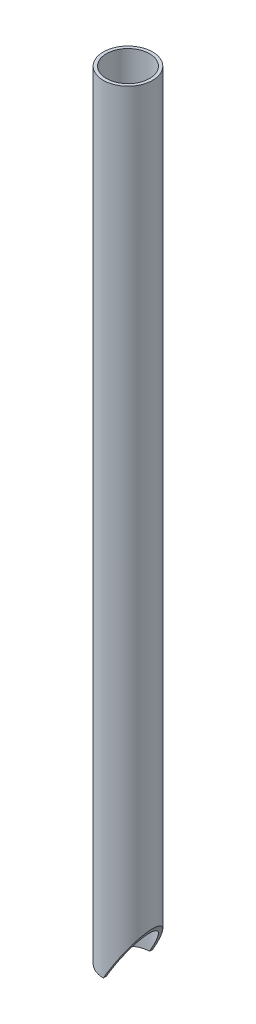
ISO-10303-21;
HEADER;
FILE_DESCRIPTION(('STEP AP214'),'2;1');
FILE_NAME('part.step','',(''),(''),'','','');
FILE_SCHEMA(('AUTOMOTIVE_DESIGN { 1 0 10303 214 1 1 1 1 }'));
ENDSEC;
DATA;
#1=APPLICATION_CONTEXT('core data for automotive mechanical design processes');
#2=APPLICATION_PROTOCOL_DEFINITION('international standard','automotive_design',2000,#1);
#3=PRODUCT_CONTEXT('',#1,'mechanical');
#4=PRODUCT('Part','Part','',(#3));
#5=PRODUCT_RELATED_PRODUCT_CATEGORY('part','',(#4));
#6=PRODUCT_DEFINITION_FORMATION('','',#4);
#7=PRODUCT_DEFINITION_CONTEXT('part definition',#1,'design');
#8=PRODUCT_DEFINITION('design','',#6,#7);
#9=PRODUCT_DEFINITION_SHAPE('','',#8);
#10=(LENGTH_UNIT() NAMED_UNIT(*) SI_UNIT(.MILLI.,.METRE.));
#11=(NAMED_UNIT(*) PLANE_ANGLE_UNIT() SI_UNIT($,.RADIAN.));
#12=(NAMED_UNIT(*) SI_UNIT($,.STERADIAN.) SOLID_ANGLE_UNIT());
#13=UNCERTAINTY_MEASURE_WITH_UNIT(LENGTH_MEASURE(1.E-05),#10,'distance_accuracy_value','');
#14=(GEOMETRIC_REPRESENTATION_CONTEXT(3) GLOBAL_UNCERTAINTY_ASSIGNED_CONTEXT((#13)) GLOBAL_UNIT_ASSIGNED_CONTEXT((#10,
#11,#12)) REPRESENTATION_CONTEXT('',''));
#15=CARTESIAN_POINT('',(0.,0.,0.));
#16=DIRECTION('',(0.,0.,1.));
#17=DIRECTION('',(1.,0.,0.));
#18=AXIS2_PLACEMENT_3D('',#15,#16,#17);
#19=CARTESIAN_POINT('',(0.,0.,0.));
#20=DIRECTION('',(0.,1.,0.));
#21=DIRECTION('',(0.,0.,1.));
#22=AXIS2_PLACEMENT_3D('',#19,#20,#21);
#23=PLANE('',#22);
#24=DIRECTION('',(0.,0.,-1.));
#25=VECTOR('',#24,1.);
#26=CARTESIAN_POINT('',(0.,0.,272.58));
#27=LINE('',#26,#25);
#28=CARTESIAN_POINT('',(0.,0.,8.00000000000006));
#29=VERTEX_POINT('',#28);
#30=CARTESIAN_POINT('',(0.,0.,7.));
#31=VERTEX_POINT('',#30);
#32=EDGE_CURVE('E57',#29,#31,#27,.T.);
#33=ORIENTED_EDGE('',*,*,#32,.F.);
#34=CARTESIAN_POINT('',(0.,0.,0.));
#35=DIRECTION('',(0.,1.,0.));
#36=DIRECTION('',(0.,0.,1.));
#37=AXIS2_PLACEMENT_3D('',#34,#35,#36);
#38=CIRCLE('',#37,8.);
#39=CARTESIAN_POINT('',(0.,0.,-7.99999999999995));
#40=VERTEX_POINT('',#39);
#41=EDGE_CURVE('E76',#40,#29,#38,.T.);
#42=ORIENTED_EDGE('',*,*,#41,.F.);
#43=CARTESIAN_POINT('',(0.,0.,-6.99999999999995));
#44=VERTEX_POINT('',#43);
#45=EDGE_CURVE('E61',#44,#40,#27,.T.);
#46=ORIENTED_EDGE('',*,*,#45,.F.);
#47=CARTESIAN_POINT('',(0.,0.,0.));
#48=DIRECTION('',(0.,1.,0.));
#49=DIRECTION('',(0.,0.,1.));
#50=AXIS2_PLACEMENT_3D('',#47,#48,#49);
#51=CIRCLE('',#50,7.);
#52=EDGE_CURVE('E72',#44,#31,#51,.T.);
#53=ORIENTED_EDGE('',*,*,#52,.T.);
#54=EDGE_LOOP('',(#33,#42,#46,#53));
#55=FACE_BOUND('',#54,.T.);
#56=ADVANCED_FACE('F41',(#55),#23,.F.);
#57=CARTESIAN_POINT('',(0.,252.432034355964,0.));
#58=DIRECTION('',(0.,-1.,0.));
#59=DIRECTION('',(0.,0.,-1.));
#60=AXIS2_PLACEMENT_3D('',#57,#58,#59);
#61=CYLINDRICAL_SURFACE('',#60,8.);
#62=CARTESIAN_POINT('',(0.,252.432034355964,0.));
#63=DIRECTION('',(0.,1.,0.));
#64=DIRECTION('',(0.,0.,1.));
#65=AXIS2_PLACEMENT_3D('',#62,#63,#64);
#66=CIRCLE('',#65,8.);
#67=CARTESIAN_POINT('',(0.,252.432034355964,8.));
#68=VERTEX_POINT('',#67);
#69=EDGE_CURVE('E50',#68,#68,#66,.T.);
#70=ORIENTED_EDGE('',*,*,#69,.F.);
#71=EDGE_LOOP('',(#70));
#72=FACE_BOUND('',#71,.T.);
#73=CARTESIAN_POINT('',(0.,0.,0.));
#74=DIRECTION('',(0.86602540378444,-0.499999999999998,0.));
#75=DIRECTION('',(-0.499999999999998,-0.86602540378444,0.));
#76=AXIS2_PLACEMENT_3D('',#73,#74,#75);
#77=ELLIPSE('',#76,16.0000000000001,8.);
#78=EDGE_CURVE('E66',#40,#29,#77,.T.);
#79=ORIENTED_EDGE('',*,*,#78,.F.);
#80=ORIENTED_EDGE('',*,*,#41,.T.);
#81=EDGE_LOOP('',(#79,#80));
#82=FACE_BOUND('',#81,.T.);
#83=ADVANCED_FACE('F43',(#72,#82),#61,.T.);
#84=CARTESIAN_POINT('',(0.,252.432034355964,0.));
#85=DIRECTION('',(0.,-1.,0.));
#86=DIRECTION('',(0.,0.,-1.));
#87=AXIS2_PLACEMENT_3D('',#84,#85,#86);
#88=CYLINDRICAL_SURFACE('',#87,7.);
#89=CARTESIAN_POINT('',(0.,252.432034355964,0.));
#90=DIRECTION('',(0.,1.,0.));
#91=DIRECTION('',(0.,0.,1.));
#92=AXIS2_PLACEMENT_3D('',#89,#90,#91);
#93=CIRCLE('',#92,7.);
#94=CARTESIAN_POINT('',(0.,252.432034355964,7.));
#95=VERTEX_POINT('',#94);
#96=EDGE_CURVE('E81',#95,#95,#93,.T.);
#97=ORIENTED_EDGE('',*,*,#96,.T.);
#98=EDGE_LOOP('',(#97));
#99=FACE_BOUND('',#98,.T.);
#100=ORIENTED_EDGE('',*,*,#52,.F.);
#101=CARTESIAN_POINT('',(0.,0.,0.));
#102=DIRECTION('',(0.86602540378444,-0.499999999999998,0.));
#103=DIRECTION('',(-0.499999999999998,-0.86602540378444,0.));
#104=AXIS2_PLACEMENT_3D('',#101,#102,#103);
#105=ELLIPSE('',#104,14.0000000000001,7.);
#106=EDGE_CURVE('E11',#44,#31,#105,.T.);
#107=ORIENTED_EDGE('',*,*,#106,.T.);
#108=EDGE_LOOP('',(#100,#107));
#109=FACE_BOUND('',#108,.T.);
#110=ADVANCED_FACE('F93',(#99,#109),#88,.F.);
#111=CARTESIAN_POINT('',(0.,252.432034355964,0.));
#112=DIRECTION('',(0.,1.,0.));
#113=DIRECTION('',(0.,0.,1.));
#114=AXIS2_PLACEMENT_3D('',#111,#112,#113);
#115=PLANE('',#114);
#116=ORIENTED_EDGE('',*,*,#69,.T.);
#117=EDGE_LOOP('',(#116));
#118=FACE_BOUND('',#117,.T.);
#119=ORIENTED_EDGE('',*,*,#96,.F.);
#120=EDGE_LOOP('',(#119));
#121=FACE_BOUND('',#120,.T.);
#122=ADVANCED_FACE('F96',(#118,#121),#115,.T.);
#123=CARTESIAN_POINT('',(0.,0.,272.58));
#124=DIRECTION('',(0.86602540378444,-0.499999999999998,0.));
#125=DIRECTION('',(0.499999999999998,0.86602540378444,0.));
#126=AXIS2_PLACEMENT_3D('',#123,#124,#125);
#127=PLANE('',#126);
#128=ORIENTED_EDGE('',*,*,#78,.T.);
#129=ORIENTED_EDGE('',*,*,#32,.T.);
#130=ORIENTED_EDGE('',*,*,#106,.F.);
#131=ORIENTED_EDGE('',*,*,#45,.T.);
#132=EDGE_LOOP('',(#128,#129,#130,#131));
#133=FACE_BOUND('',#132,.T.);
#134=ADVANCED_FACE('F67',(#133),#127,.T.);
#135=CLOSED_SHELL('',(#56,#83,#110,#122,#134));
#136=MANIFOLD_SOLID_BREP('B2',#135);
#137=ADVANCED_BREP_SHAPE_REPRESENTATION('',(#18,#136),#14);
#138=SHAPE_DEFINITION_REPRESENTATION(#9,#137);
ENDSEC;
END-ISO-10303-21;
